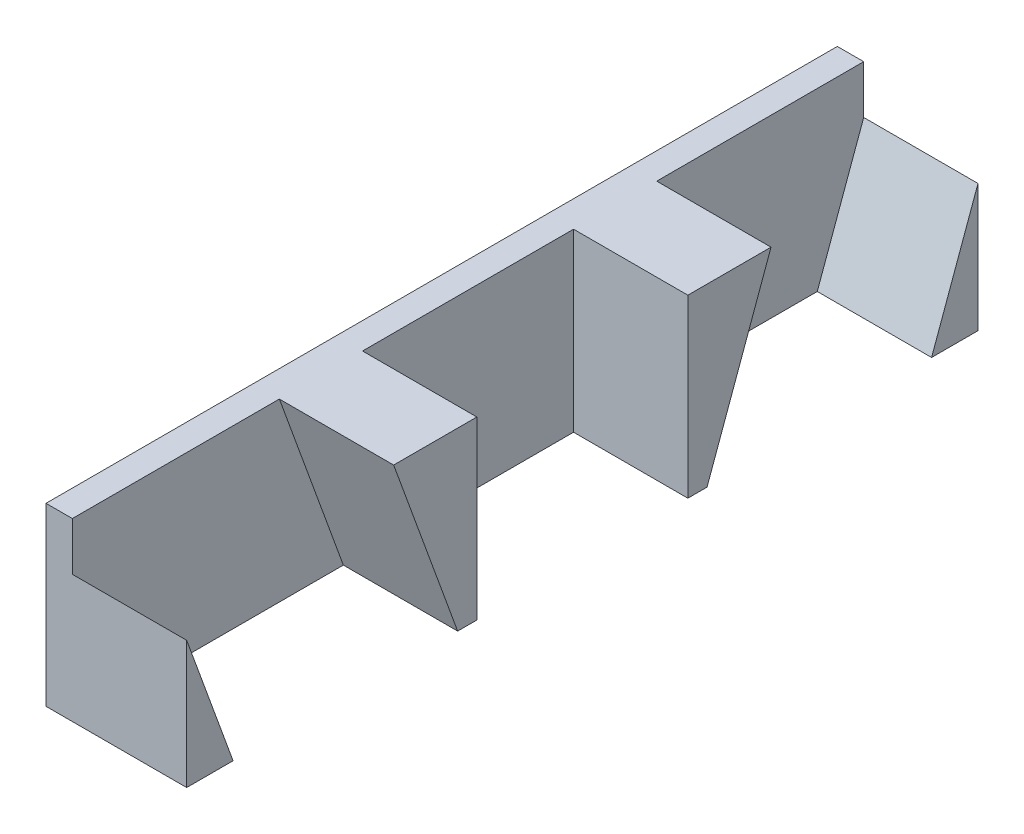
ISO-10303-21;
HEADER;
FILE_DESCRIPTION(('STEP AP214'),'2;1');
FILE_NAME('part.step','',(''),(''),'','','');
FILE_SCHEMA(('AUTOMOTIVE_DESIGN { 1 0 10303 214 1 1 1 1 }'));
ENDSEC;
DATA;
#1=APPLICATION_CONTEXT('core data for automotive mechanical design processes');
#2=APPLICATION_PROTOCOL_DEFINITION('international standard','automotive_design',2000,#1);
#3=PRODUCT_CONTEXT('',#1,'mechanical');
#4=PRODUCT('Part','Part','',(#3));
#5=PRODUCT_RELATED_PRODUCT_CATEGORY('part','',(#4));
#6=PRODUCT_DEFINITION_FORMATION('','',#4);
#7=PRODUCT_DEFINITION_CONTEXT('part definition',#1,'design');
#8=PRODUCT_DEFINITION('design','',#6,#7);
#9=PRODUCT_DEFINITION_SHAPE('','',#8);
#10=(LENGTH_UNIT() NAMED_UNIT(*) SI_UNIT(.MILLI.,.METRE.));
#11=(NAMED_UNIT(*) PLANE_ANGLE_UNIT() SI_UNIT($,.RADIAN.));
#12=(NAMED_UNIT(*) SI_UNIT($,.STERADIAN.) SOLID_ANGLE_UNIT());
#13=UNCERTAINTY_MEASURE_WITH_UNIT(LENGTH_MEASURE(1.E-05),#10,'distance_accuracy_value','');
#14=(GEOMETRIC_REPRESENTATION_CONTEXT(3) GLOBAL_UNCERTAINTY_ASSIGNED_CONTEXT((#13)) GLOBAL_UNIT_ASSIGNED_CONTEXT((#10,
#11,#12)) REPRESENTATION_CONTEXT('',''));
#15=CARTESIAN_POINT('',(0.,0.,0.));
#16=DIRECTION('',(0.,0.,1.));
#17=DIRECTION('',(1.,0.,0.));
#18=AXIS2_PLACEMENT_3D('',#15,#16,#17);
#19=CARTESIAN_POINT('',(-3.5,28.9942257782166,49.));
#20=DIRECTION('',(0.,1.,0.));
#21=DIRECTION('',(0.,0.,1.));
#22=AXIS2_PLACEMENT_3D('',#19,#20,#21);
#23=PLANE('',#22);
#24=DIRECTION('',(0.,0.,1.));
#25=VECTOR('',#24,1.);
#26=CARTESIAN_POINT('',(20.5,28.9942257782166,49.));
#27=LINE('',#26,#25);
#28=CARTESIAN_POINT('',(20.5,28.9942257782166,44.360297657338));
#29=VERTEX_POINT('',#28);
#30=CARTESIAN_POINT('',(20.5,28.9942257782166,47.));
#31=VERTEX_POINT('',#30);
#32=EDGE_CURVE('E168',#29,#31,#27,.T.);
#33=ORIENTED_EDGE('',*,*,#32,.T.);
#34=DIRECTION('',(1.,0.,0.));
#35=VECTOR('',#34,1.);
#36=CARTESIAN_POINT('',(12.5,28.9942257782166,47.));
#37=LINE('',#36,#35);
#38=CARTESIAN_POINT('',(12.5,28.9942257782166,47.));
#39=VERTEX_POINT('',#38);
#40=EDGE_CURVE('E151',#39,#31,#37,.T.);
#41=ORIENTED_EDGE('',*,*,#40,.F.);
#42=DIRECTION('',(0.,0.,-1.));
#43=VECTOR('',#42,1.);
#44=CARTESIAN_POINT('',(12.5,28.9942257782166,47.5));
#45=LINE('',#44,#43);
#46=CARTESIAN_POINT('',(12.5,28.9942257782166,2.));
#47=VERTEX_POINT('',#46);
#48=EDGE_CURVE('E165',#39,#47,#45,.T.);
#49=ORIENTED_EDGE('',*,*,#48,.T.);
#50=DIRECTION('',(1.,0.,0.));
#51=VECTOR('',#50,1.);
#52=CARTESIAN_POINT('',(12.5,28.9942257782166,2.));
#53=LINE('',#52,#51);
#54=CARTESIAN_POINT('',(20.5,28.9942257782166,2.));
#55=VERTEX_POINT('',#54);
#56=EDGE_CURVE('E272',#47,#55,#53,.T.);
#57=ORIENTED_EDGE('',*,*,#56,.T.);
#58=CARTESIAN_POINT('',(20.5,28.9942257782166,4.63970234266202));
#59=VERTEX_POINT('',#58);
#60=EDGE_CURVE('E177',#55,#59,#27,.T.);
#61=ORIENTED_EDGE('',*,*,#60,.T.);
#62=DIRECTION('',(1.,0.,0.));
#63=VECTOR('',#62,1.);
#64=CARTESIAN_POINT('',(14.,28.9942257782166,4.63970234266202));
#65=LINE('',#64,#63);
#66=CARTESIAN_POINT('',(14.,28.9942257782166,4.63970234266202));
#67=VERTEX_POINT('',#66);
#68=EDGE_CURVE('E221',#67,#59,#65,.T.);
#69=ORIENTED_EDGE('',*,*,#68,.F.);
#70=DIRECTION('',(0.,0.,-1.));
#71=VECTOR('',#70,1.);
#72=CARTESIAN_POINT('',(14.,28.9942257782166,17.409835612373));
#73=LINE('',#72,#71);
#74=CARTESIAN_POINT('',(14.,28.9942257782166,17.409835612373));
#75=VERTEX_POINT('',#74);
#76=EDGE_CURVE('E205',#75,#67,#73,.T.);
#77=ORIENTED_EDGE('',*,*,#76,.F.);
#78=DIRECTION('',(1.,0.,0.));
#79=VECTOR('',#78,1.);
#80=CARTESIAN_POINT('',(14.,28.9942257782166,17.409835612373));
#81=LINE('',#80,#79);
#82=CARTESIAN_POINT('',(20.5,28.9942257782166,17.409835612373));
#83=VERTEX_POINT('',#82);
#84=EDGE_CURVE('E213',#75,#83,#81,.T.);
#85=ORIENTED_EDGE('',*,*,#84,.T.);
#86=CARTESIAN_POINT('',(20.5,28.9942257782166,18.5));
#87=VERTEX_POINT('',#86);
#88=EDGE_CURVE('E185',#83,#87,#27,.T.);
#89=ORIENTED_EDGE('',*,*,#88,.T.);
#90=DIRECTION('',(1.,0.,0.));
#91=VECTOR('',#90,1.);
#92=CARTESIAN_POINT('',(14.,28.9942257782166,18.5));
#93=LINE('',#92,#91);
#94=CARTESIAN_POINT('',(14.,28.9942257782166,18.5));
#95=VERTEX_POINT('',#94);
#96=EDGE_CURVE('E216',#95,#87,#93,.T.);
#97=ORIENTED_EDGE('',*,*,#96,.F.);
#98=DIRECTION('',(0.,0.,-1.));
#99=VECTOR('',#98,1.);
#100=CARTESIAN_POINT('',(14.,28.9942257782166,30.5));
#101=LINE('',#100,#99);
#102=CARTESIAN_POINT('',(14.,28.9942257782166,30.5));
#103=VERTEX_POINT('',#102);
#104=EDGE_CURVE('E236',#103,#95,#101,.T.);
#105=ORIENTED_EDGE('',*,*,#104,.F.);
#106=DIRECTION('',(1.,0.,0.));
#107=VECTOR('',#106,1.);
#108=CARTESIAN_POINT('',(14.,28.9942257782166,30.5));
#109=LINE('',#108,#107);
#110=CARTESIAN_POINT('',(20.5,28.9942257782166,30.5));
#111=VERTEX_POINT('',#110);
#112=EDGE_CURVE('E245',#103,#111,#109,.T.);
#113=ORIENTED_EDGE('',*,*,#112,.T.);
#114=CARTESIAN_POINT('',(20.5,28.9942257782166,31.590164387627));
#115=VERTEX_POINT('',#114);
#116=EDGE_CURVE('E175',#111,#115,#27,.T.);
#117=ORIENTED_EDGE('',*,*,#116,.T.);
#118=DIRECTION('',(1.,0.,0.));
#119=VECTOR('',#118,1.);
#120=CARTESIAN_POINT('',(14.,28.9942257782166,31.590164387627));
#121=LINE('',#120,#119);
#122=CARTESIAN_POINT('',(14.,28.9942257782166,31.590164387627));
#123=VERTEX_POINT('',#122);
#124=EDGE_CURVE('E179',#123,#115,#121,.T.);
#125=ORIENTED_EDGE('',*,*,#124,.F.);
#126=DIRECTION('',(0.,0.,-1.));
#127=VECTOR('',#126,1.);
#128=CARTESIAN_POINT('',(14.,28.9942257782166,31.590164387627));
#129=LINE('',#128,#127);
#130=CARTESIAN_POINT('',(14.,28.9942257782166,44.360297657338));
#131=VERTEX_POINT('',#130);
#132=EDGE_CURVE('E261',#131,#123,#129,.T.);
#133=ORIENTED_EDGE('',*,*,#132,.F.);
#134=DIRECTION('',(1.,0.,0.));
#135=VECTOR('',#134,1.);
#136=CARTESIAN_POINT('',(14.,28.9942257782166,44.360297657338));
#137=LINE('',#136,#135);
#138=EDGE_CURVE('E252',#131,#29,#137,.T.);
#139=ORIENTED_EDGE('',*,*,#138,.T.);
#140=EDGE_LOOP('',(#33,#41,#49,#57,#61,#69,#77,#85,#89,#97,#105,#113,#117,#125,#133,#139));
#141=FACE_BOUND('',#140,.T.);
#142=ADVANCED_FACE('F39',(#141),#23,.F.);
#143=CARTESIAN_POINT('',(0.,38.9942257782166,0.));
#144=DIRECTION('',(0.,1.,0.));
#145=DIRECTION('',(0.,0.,1.));
#146=AXIS2_PLACEMENT_3D('',#143,#144,#145);
#147=PLANE('',#146);
#148=DIRECTION('',(1.,0.,0.));
#149=VECTOR('',#148,1.);
#150=CARTESIAN_POINT('',(12.5,38.9942257782166,47.));
#151=LINE('',#150,#149);
#152=CARTESIAN_POINT('',(12.5,38.9942257782166,47.));
#153=VERTEX_POINT('',#152);
#154=CARTESIAN_POINT('',(14.,38.9942257782166,47.));
#155=VERTEX_POINT('',#154);
#156=EDGE_CURVE('E154',#153,#155,#151,.T.);
#157=ORIENTED_EDGE('',*,*,#156,.T.);
#158=DIRECTION('',(0.,0.,1.));
#159=VECTOR('',#158,1.);
#160=CARTESIAN_POINT('',(14.,38.9942257782166,48.));
#161=LINE('',#160,#159);
#162=CARTESIAN_POINT('',(14.,38.9942257782166,35.2298667302891));
#163=VERTEX_POINT('',#162);
#164=EDGE_CURVE('E258',#163,#155,#161,.T.);
#165=ORIENTED_EDGE('',*,*,#164,.F.);
#166=DIRECTION('',(1.,0.,0.));
#167=VECTOR('',#166,1.);
#168=CARTESIAN_POINT('',(14.,38.9942257782166,35.2298667302891));
#169=LINE('',#168,#167);
#170=CARTESIAN_POINT('',(20.5,38.9942257782166,35.2298667302891));
#171=VERTEX_POINT('',#170);
#172=EDGE_CURVE('E173',#163,#171,#169,.T.);
#173=ORIENTED_EDGE('',*,*,#172,.T.);
#174=DIRECTION('',(0.,0.,1.));
#175=VECTOR('',#174,1.);
#176=CARTESIAN_POINT('',(20.5,38.9942257782166,49.));
#177=LINE('',#176,#175);
#178=CARTESIAN_POINT('',(20.5,38.9942257782166,30.5));
#179=VERTEX_POINT('',#178);
#180=EDGE_CURVE('E182',#179,#171,#177,.T.);
#181=ORIENTED_EDGE('',*,*,#180,.F.);
#182=DIRECTION('',(1.,0.,0.));
#183=VECTOR('',#182,1.);
#184=CARTESIAN_POINT('',(14.,38.9942257782166,30.5));
#185=LINE('',#184,#183);
#186=CARTESIAN_POINT('',(14.,38.9942257782166,30.5));
#187=VERTEX_POINT('',#186);
#188=EDGE_CURVE('E248',#187,#179,#185,.T.);
#189=ORIENTED_EDGE('',*,*,#188,.F.);
#190=DIRECTION('',(0.,0.,1.));
#191=VECTOR('',#190,1.);
#192=CARTESIAN_POINT('',(14.,38.9942257782166,30.5));
#193=LINE('',#192,#191);
#194=CARTESIAN_POINT('',(14.,38.9942257782166,18.5));
#195=VERTEX_POINT('',#194);
#196=EDGE_CURVE('E230',#195,#187,#193,.T.);
#197=ORIENTED_EDGE('',*,*,#196,.F.);
#198=DIRECTION('',(1.,0.,0.));
#199=VECTOR('',#198,1.);
#200=CARTESIAN_POINT('',(14.,38.9942257782166,18.5));
#201=LINE('',#200,#199);
#202=CARTESIAN_POINT('',(20.5,38.9942257782166,18.5));
#203=VERTEX_POINT('',#202);
#204=EDGE_CURVE('E239',#195,#203,#201,.T.);
#205=ORIENTED_EDGE('',*,*,#204,.T.);
#206=CARTESIAN_POINT('',(20.5,38.9942257782166,13.7701332697109));
#207=VERTEX_POINT('',#206);
#208=EDGE_CURVE('E186',#207,#203,#177,.T.);
#209=ORIENTED_EDGE('',*,*,#208,.F.);
#210=DIRECTION('',(1.,0.,0.));
#211=VECTOR('',#210,1.);
#212=CARTESIAN_POINT('',(14.,38.9942257782166,13.7701332697109));
#213=LINE('',#212,#211);
#214=CARTESIAN_POINT('',(14.,38.9942257782166,13.7701332697109));
#215=VERTEX_POINT('',#214);
#216=EDGE_CURVE('E219',#215,#207,#213,.T.);
#217=ORIENTED_EDGE('',*,*,#216,.F.);
#218=DIRECTION('',(0.,0.,1.));
#219=VECTOR('',#218,1.);
#220=CARTESIAN_POINT('',(14.,38.9942257782166,0.999999999999989));
#221=LINE('',#220,#219);
#222=CARTESIAN_POINT('',(14.,38.9942257782166,2.));
#223=VERTEX_POINT('',#222);
#224=EDGE_CURVE('E211',#223,#215,#221,.T.);
#225=ORIENTED_EDGE('',*,*,#224,.F.);
#226=DIRECTION('',(1.,0.,0.));
#227=VECTOR('',#226,1.);
#228=CARTESIAN_POINT('',(12.5,38.9942257782166,2.));
#229=LINE('',#228,#227);
#230=CARTESIAN_POINT('',(12.5,38.9942257782166,2.));
#231=VERTEX_POINT('',#230);
#232=EDGE_CURVE('E52',#231,#223,#229,.T.);
#233=ORIENTED_EDGE('',*,*,#232,.F.);
#234=DIRECTION('',(0.,0.,-1.));
#235=VECTOR('',#234,1.);
#236=CARTESIAN_POINT('',(12.5,38.9942257782166,47.5));
#237=LINE('',#236,#235);
#238=EDGE_CURVE('E184',#153,#231,#237,.T.);
#239=ORIENTED_EDGE('',*,*,#238,.F.);
#240=EDGE_LOOP('',(#157,#165,#173,#181,#189,#197,#205,#209,#217,#225,#233,#239));
#241=FACE_BOUND('',#240,.T.);
#242=ADVANCED_FACE('F295',(#241),#147,.T.);
#243=CARTESIAN_POINT('',(20.5,38.9942257782166,49.));
#244=DIRECTION('',(1.,0.,0.));
#245=DIRECTION('',(0.,0.,-1.));
#246=AXIS2_PLACEMENT_3D('',#243,#244,#245);
#247=PLANE('',#246);
#248=DIRECTION('',(0.,0.939692620785908,0.342020143325669));
#249=VECTOR('',#248,1.);
#250=CARTESIAN_POINT('',(20.5,38.9942257782166,35.2298667302891));
#251=LINE('',#250,#249);
#252=EDGE_CURVE('E256',#115,#171,#251,.T.);
#253=ORIENTED_EDGE('',*,*,#252,.F.);
#254=ORIENTED_EDGE('',*,*,#116,.F.);
#255=DIRECTION('',(0.,-1.,0.));
#256=VECTOR('',#255,1.);
#257=CARTESIAN_POINT('',(20.5,28.9942257782166,30.5));
#258=LINE('',#257,#256);
#259=EDGE_CURVE('E229',#179,#111,#258,.T.);
#260=ORIENTED_EDGE('',*,*,#259,.F.);
#261=ORIENTED_EDGE('',*,*,#180,.T.);
#262=EDGE_LOOP('',(#253,#254,#260,#261));
#263=FACE_BOUND('',#262,.T.);
#264=ADVANCED_FACE('F291',(#263),#247,.T.);
#265=DIRECTION('',(0.,1.,0.));
#266=VECTOR('',#265,1.);
#267=CARTESIAN_POINT('',(20.5,28.9942257782166,18.5));
#268=LINE('',#267,#266);
#269=EDGE_CURVE('E240',#87,#203,#268,.T.);
#270=ORIENTED_EDGE('',*,*,#269,.F.);
#271=ORIENTED_EDGE('',*,*,#88,.F.);
#272=DIRECTION('',(0.,-0.939692620785908,0.342020143325669));
#273=VECTOR('',#272,1.);
#274=CARTESIAN_POINT('',(20.5,38.9942257782166,13.7701332697109));
#275=LINE('',#274,#273);
#276=EDGE_CURVE('E214',#207,#83,#275,.T.);
#277=ORIENTED_EDGE('',*,*,#276,.F.);
#278=ORIENTED_EDGE('',*,*,#208,.T.);
#279=EDGE_LOOP('',(#270,#271,#277,#278));
#280=FACE_BOUND('',#279,.T.);
#281=ADVANCED_FACE('F284',(#280),#247,.T.);
#282=DIRECTION('',(0.,1.,0.));
#283=VECTOR('',#282,1.);
#284=CARTESIAN_POINT('',(20.5,38.9942257782166,47.));
#285=LINE('',#284,#283);
#286=CARTESIAN_POINT('',(20.5,36.246748358762,47.));
#287=VERTEX_POINT('',#286);
#288=EDGE_CURVE('E159',#31,#287,#285,.T.);
#289=ORIENTED_EDGE('',*,*,#288,.F.);
#290=ORIENTED_EDGE('',*,*,#32,.F.);
#291=DIRECTION('',(0.,-0.939692620785908,-0.34202014332567));
#292=VECTOR('',#291,1.);
#293=CARTESIAN_POINT('',(20.5,38.9942257782166,48.));
#294=LINE('',#293,#292);
#295=EDGE_CURVE('E242',#287,#29,#294,.T.);
#296=ORIENTED_EDGE('',*,*,#295,.F.);
#297=EDGE_LOOP('',(#289,#290,#296));
#298=FACE_BOUND('',#297,.T.);
#299=ADVANCED_FACE('F281',(#298),#247,.T.);
#300=DIRECTION('',(0.,-1.,0.));
#301=VECTOR('',#300,1.);
#302=CARTESIAN_POINT('',(20.5,38.9942257782166,2.));
#303=LINE('',#302,#301);
#304=CARTESIAN_POINT('',(20.5,36.2467483587619,2.));
#305=VERTEX_POINT('',#304);
#306=EDGE_CURVE('E270',#305,#55,#303,.T.);
#307=ORIENTED_EDGE('',*,*,#306,.F.);
#308=DIRECTION('',(0.,0.939692620785908,-0.34202014332567));
#309=VECTOR('',#308,1.);
#310=CARTESIAN_POINT('',(20.5,38.9942257782166,0.99999999999999));
#311=LINE('',#310,#309);
#312=EDGE_CURVE('E204',#59,#305,#311,.T.);
#313=ORIENTED_EDGE('',*,*,#312,.F.);
#314=ORIENTED_EDGE('',*,*,#60,.F.);
#315=EDGE_LOOP('',(#307,#313,#314));
#316=FACE_BOUND('',#315,.T.);
#317=ADVANCED_FACE('F283',(#316),#247,.T.);
#318=CARTESIAN_POINT('',(12.5,38.9942257782166,47.5));
#319=DIRECTION('',(-1.,0.,0.));
#320=DIRECTION('',(0.,0.,1.));
#321=AXIS2_PLACEMENT_3D('',#318,#319,#320);
#322=PLANE('',#321);
#323=DIRECTION('',(0.,1.,0.));
#324=VECTOR('',#323,1.);
#325=CARTESIAN_POINT('',(12.5,38.9942257782166,47.));
#326=LINE('',#325,#324);
#327=EDGE_CURVE('E148',#39,#153,#326,.T.);
#328=ORIENTED_EDGE('',*,*,#327,.T.);
#329=ORIENTED_EDGE('',*,*,#238,.T.);
#330=DIRECTION('',(0.,-1.,0.));
#331=VECTOR('',#330,1.);
#332=CARTESIAN_POINT('',(12.5,38.9942257782166,2.));
#333=LINE('',#332,#331);
#334=EDGE_CURVE('E172',#231,#47,#333,.T.);
#335=ORIENTED_EDGE('',*,*,#334,.T.);
#336=ORIENTED_EDGE('',*,*,#48,.F.);
#337=EDGE_LOOP('',(#328,#329,#335,#336));
#338=FACE_BOUND('',#337,.T.);
#339=ADVANCED_FACE('F171',(#338),#322,.T.);
#340=CARTESIAN_POINT('',(14.,38.9942257782166,13.7701332697109));
#341=DIRECTION('',(0.,0.342020143325669,0.939692620785908));
#342=DIRECTION('',(0.,-0.939692620785908,0.342020143325669));
#343=AXIS2_PLACEMENT_3D('',#340,#341,#342);
#344=PLANE('',#343);
#345=ORIENTED_EDGE('',*,*,#276,.T.);
#346=ORIENTED_EDGE('',*,*,#84,.F.);
#347=DIRECTION('',(0.,-0.939692620785908,0.342020143325669));
#348=VECTOR('',#347,1.);
#349=CARTESIAN_POINT('',(14.,38.9942257782166,13.7701332697109));
#350=LINE('',#349,#348);
#351=EDGE_CURVE('E201',#215,#75,#350,.T.);
#352=ORIENTED_EDGE('',*,*,#351,.F.);
#353=ORIENTED_EDGE('',*,*,#216,.T.);
#354=EDGE_LOOP('',(#345,#346,#352,#353));
#355=FACE_BOUND('',#354,.T.);
#356=ADVANCED_FACE('F312',(#355),#344,.F.);
#357=CARTESIAN_POINT('',(14.,38.9942257782166,0.999999999999989));
#358=DIRECTION('',(0.,-0.34202014332567,-0.939692620785908));
#359=DIRECTION('',(0.,0.939692620785908,-0.34202014332567));
#360=AXIS2_PLACEMENT_3D('',#357,#358,#359);
#361=PLANE('',#360);
#362=ORIENTED_EDGE('',*,*,#312,.T.);
#363=DIRECTION('',(-1.,0.,0.));
#364=VECTOR('',#363,1.);
#365=CARTESIAN_POINT('',(14.,36.2467483587619,2.));
#366=LINE('',#365,#364);
#367=CARTESIAN_POINT('',(14.,36.2467483587619,2.));
#368=VERTEX_POINT('',#367);
#369=EDGE_CURVE('E222',#305,#368,#366,.T.);
#370=ORIENTED_EDGE('',*,*,#369,.T.);
#371=DIRECTION('',(0.,0.939692620785908,-0.34202014332567));
#372=VECTOR('',#371,1.);
#373=CARTESIAN_POINT('',(14.,38.9942257782166,0.999999999999989));
#374=LINE('',#373,#372);
#375=EDGE_CURVE('E208',#67,#368,#374,.T.);
#376=ORIENTED_EDGE('',*,*,#375,.F.);
#377=ORIENTED_EDGE('',*,*,#68,.T.);
#378=EDGE_LOOP('',(#362,#370,#376,#377));
#379=FACE_BOUND('',#378,.T.);
#380=ADVANCED_FACE('F308',(#379),#361,.F.);
#381=CARTESIAN_POINT('',(14.,0.,0.));
#382=DIRECTION('',(1.,0.,0.));
#383=DIRECTION('',(0.,0.,-1.));
#384=AXIS2_PLACEMENT_3D('',#381,#382,#383);
#385=PLANE('',#384);
#386=DIRECTION('',(0.,-1.,0.));
#387=VECTOR('',#386,1.);
#388=CARTESIAN_POINT('',(14.,0.,2.));
#389=LINE('',#388,#387);
#390=EDGE_CURVE('E11',#223,#368,#389,.T.);
#391=ORIENTED_EDGE('',*,*,#390,.F.);
#392=ORIENTED_EDGE('',*,*,#224,.T.);
#393=ORIENTED_EDGE('',*,*,#351,.T.);
#394=ORIENTED_EDGE('',*,*,#76,.T.);
#395=ORIENTED_EDGE('',*,*,#375,.T.);
#396=EDGE_LOOP('',(#391,#392,#393,#394,#395));
#397=FACE_BOUND('',#396,.T.);
#398=ADVANCED_FACE('F304',(#397),#385,.T.);
#399=CARTESIAN_POINT('',(14.,28.9942257782166,18.5));
#400=DIRECTION('',(0.,0.,-1.));
#401=DIRECTION('',(-1.,0.,0.));
#402=AXIS2_PLACEMENT_3D('',#399,#400,#401);
#403=PLANE('',#402);
#404=ORIENTED_EDGE('',*,*,#269,.T.);
#405=ORIENTED_EDGE('',*,*,#204,.F.);
#406=DIRECTION('',(0.,1.,0.));
#407=VECTOR('',#406,1.);
#408=CARTESIAN_POINT('',(14.,28.9942257782166,18.5));
#409=LINE('',#408,#407);
#410=EDGE_CURVE('E227',#95,#195,#409,.T.);
#411=ORIENTED_EDGE('',*,*,#410,.F.);
#412=ORIENTED_EDGE('',*,*,#96,.T.);
#413=EDGE_LOOP('',(#404,#405,#411,#412));
#414=FACE_BOUND('',#413,.T.);
#415=ADVANCED_FACE('F307',(#414),#403,.F.);
#416=CARTESIAN_POINT('',(14.,28.9942257782166,30.5));
#417=DIRECTION('',(0.,0.,1.));
#418=DIRECTION('',(1.,0.,0.));
#419=AXIS2_PLACEMENT_3D('',#416,#417,#418);
#420=PLANE('',#419);
#421=ORIENTED_EDGE('',*,*,#259,.T.);
#422=ORIENTED_EDGE('',*,*,#112,.F.);
#423=DIRECTION('',(0.,-1.,0.));
#424=VECTOR('',#423,1.);
#425=CARTESIAN_POINT('',(14.,28.9942257782166,30.5));
#426=LINE('',#425,#424);
#427=EDGE_CURVE('E233',#187,#103,#426,.T.);
#428=ORIENTED_EDGE('',*,*,#427,.F.);
#429=ORIENTED_EDGE('',*,*,#188,.T.);
#430=EDGE_LOOP('',(#421,#422,#428,#429));
#431=FACE_BOUND('',#430,.T.);
#432=ADVANCED_FACE('F321',(#431),#420,.F.);
#433=CARTESIAN_POINT('',(14.,0.,0.));
#434=DIRECTION('',(-1.,0.,0.));
#435=DIRECTION('',(0.,0.,1.));
#436=AXIS2_PLACEMENT_3D('',#433,#434,#435);
#437=PLANE('',#436);
#438=ORIENTED_EDGE('',*,*,#410,.T.);
#439=ORIENTED_EDGE('',*,*,#196,.T.);
#440=ORIENTED_EDGE('',*,*,#427,.T.);
#441=ORIENTED_EDGE('',*,*,#104,.T.);
#442=EDGE_LOOP('',(#438,#439,#440,#441));
#443=FACE_BOUND('',#442,.T.);
#444=ADVANCED_FACE('F317',(#443),#437,.F.);
#445=CARTESIAN_POINT('',(14.,38.9942257782166,35.2298667302891));
#446=DIRECTION('',(0.,0.342020143325669,-0.939692620785908));
#447=DIRECTION('',(0.,0.939692620785908,0.342020143325669));
#448=AXIS2_PLACEMENT_3D('',#445,#446,#447);
#449=PLANE('',#448);
#450=ORIENTED_EDGE('',*,*,#252,.T.);
#451=ORIENTED_EDGE('',*,*,#172,.F.);
#452=DIRECTION('',(0.,0.939692620785908,0.342020143325669));
#453=VECTOR('',#452,1.);
#454=CARTESIAN_POINT('',(14.,38.9942257782166,35.2298667302891));
#455=LINE('',#454,#453);
#456=EDGE_CURVE('E254',#123,#163,#455,.T.);
#457=ORIENTED_EDGE('',*,*,#456,.F.);
#458=ORIENTED_EDGE('',*,*,#124,.T.);
#459=EDGE_LOOP('',(#450,#451,#457,#458));
#460=FACE_BOUND('',#459,.T.);
#461=ADVANCED_FACE('F320',(#460),#449,.F.);
#462=CARTESIAN_POINT('',(14.,38.9942257782166,48.));
#463=DIRECTION('',(0.,-0.34202014332567,0.939692620785908));
#464=DIRECTION('',(0.,-0.939692620785908,-0.34202014332567));
#465=AXIS2_PLACEMENT_3D('',#462,#463,#464);
#466=PLANE('',#465);
#467=DIRECTION('',(0.,-0.939692620785908,-0.34202014332567));
#468=VECTOR('',#467,1.);
#469=CARTESIAN_POINT('',(14.,38.9942257782166,48.));
#470=LINE('',#469,#468);
#471=CARTESIAN_POINT('',(14.,36.246748358762,47.));
#472=VERTEX_POINT('',#471);
#473=EDGE_CURVE('E263',#472,#131,#470,.T.);
#474=ORIENTED_EDGE('',*,*,#473,.F.);
#475=DIRECTION('',(1.,0.,0.));
#476=VECTOR('',#475,1.);
#477=CARTESIAN_POINT('',(14.,36.246748358762,47.));
#478=LINE('',#477,#476);
#479=EDGE_CURVE('E60',#472,#287,#478,.T.);
#480=ORIENTED_EDGE('',*,*,#479,.T.);
#481=ORIENTED_EDGE('',*,*,#295,.T.);
#482=ORIENTED_EDGE('',*,*,#138,.F.);
#483=EDGE_LOOP('',(#474,#480,#481,#482));
#484=FACE_BOUND('',#483,.T.);
#485=ADVANCED_FACE('F279',(#484),#466,.F.);
#486=CARTESIAN_POINT('',(14.,0.,0.));
#487=DIRECTION('',(-1.,0.,0.));
#488=DIRECTION('',(0.,0.,1.));
#489=AXIS2_PLACEMENT_3D('',#486,#487,#488);
#490=PLANE('',#489);
#491=ORIENTED_EDGE('',*,*,#164,.T.);
#492=DIRECTION('',(0.,-1.,0.));
#493=VECTOR('',#492,1.);
#494=CARTESIAN_POINT('',(14.,0.,47.));
#495=LINE('',#494,#493);
#496=EDGE_CURVE('E46',#155,#472,#495,.T.);
#497=ORIENTED_EDGE('',*,*,#496,.T.);
#498=ORIENTED_EDGE('',*,*,#473,.T.);
#499=ORIENTED_EDGE('',*,*,#132,.T.);
#500=ORIENTED_EDGE('',*,*,#456,.T.);
#501=EDGE_LOOP('',(#491,#497,#498,#499,#500));
#502=FACE_BOUND('',#501,.T.);
#503=ADVANCED_FACE('F331',(#502),#490,.F.);
#504=CARTESIAN_POINT('',(12.5,38.9942257782166,47.));
#505=DIRECTION('',(0.,0.,-1.));
#506=DIRECTION('',(-1.,0.,0.));
#507=AXIS2_PLACEMENT_3D('',#504,#505,#506);
#508=PLANE('',#507);
#509=ORIENTED_EDGE('',*,*,#496,.F.);
#510=ORIENTED_EDGE('',*,*,#156,.F.);
#511=ORIENTED_EDGE('',*,*,#327,.F.);
#512=ORIENTED_EDGE('',*,*,#40,.T.);
#513=ORIENTED_EDGE('',*,*,#288,.T.);
#514=ORIENTED_EDGE('',*,*,#479,.F.);
#515=EDGE_LOOP('',(#509,#510,#511,#512,#513,#514));
#516=FACE_BOUND('',#515,.T.);
#517=ADVANCED_FACE('F150',(#516),#508,.F.);
#518=CARTESIAN_POINT('',(12.5,38.9942257782166,2.));
#519=DIRECTION('',(0.,0.,1.));
#520=DIRECTION('',(1.,0.,0.));
#521=AXIS2_PLACEMENT_3D('',#518,#519,#520);
#522=PLANE('',#521);
#523=ORIENTED_EDGE('',*,*,#306,.T.);
#524=ORIENTED_EDGE('',*,*,#56,.F.);
#525=ORIENTED_EDGE('',*,*,#334,.F.);
#526=ORIENTED_EDGE('',*,*,#232,.T.);
#527=ORIENTED_EDGE('',*,*,#390,.T.);
#528=ORIENTED_EDGE('',*,*,#369,.F.);
#529=EDGE_LOOP('',(#523,#524,#525,#526,#527,#528));
#530=FACE_BOUND('',#529,.T.);
#531=ADVANCED_FACE('F337',(#530),#522,.F.);
#532=CLOSED_SHELL('',(#142,#242,#264,#281,#299,#317,#339,#356,#380,#398,#415,#432,#444,#461,
#485,#503,#517,#531));
#533=MANIFOLD_SOLID_BREP('B2',#532);
#534=ADVANCED_BREP_SHAPE_REPRESENTATION('',(#18,#533),#14);
#535=SHAPE_DEFINITION_REPRESENTATION(#9,#534);
ENDSEC;
END-ISO-10303-21;
